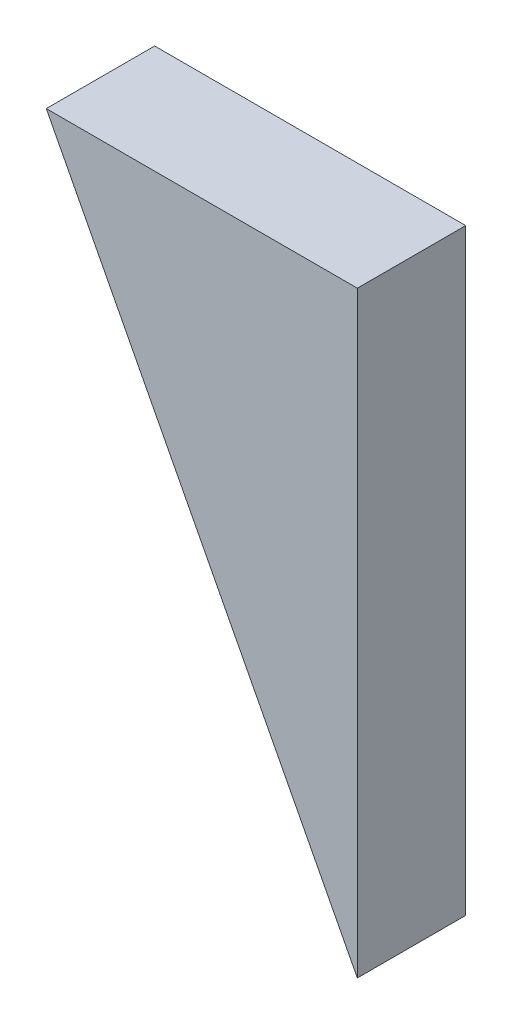
ISO-10303-21;
HEADER;
FILE_DESCRIPTION(('STEP AP214'),'2;1');
FILE_NAME('part.step','',(''),(''),'','','');
FILE_SCHEMA(('AUTOMOTIVE_DESIGN { 1 0 10303 214 1 1 1 1 }'));
ENDSEC;
DATA;
#1=APPLICATION_CONTEXT('core data for automotive mechanical design processes');
#2=APPLICATION_PROTOCOL_DEFINITION('international standard','automotive_design',2000,#1);
#3=PRODUCT_CONTEXT('',#1,'mechanical');
#4=PRODUCT('Part','Part','',(#3));
#5=PRODUCT_RELATED_PRODUCT_CATEGORY('part','',(#4));
#6=PRODUCT_DEFINITION_FORMATION('','',#4);
#7=PRODUCT_DEFINITION_CONTEXT('part definition',#1,'design');
#8=PRODUCT_DEFINITION('design','',#6,#7);
#9=PRODUCT_DEFINITION_SHAPE('','',#8);
#10=(LENGTH_UNIT() NAMED_UNIT(*) SI_UNIT(.MILLI.,.METRE.));
#11=(NAMED_UNIT(*) PLANE_ANGLE_UNIT() SI_UNIT($,.RADIAN.));
#12=(NAMED_UNIT(*) SI_UNIT($,.STERADIAN.) SOLID_ANGLE_UNIT());
#13=UNCERTAINTY_MEASURE_WITH_UNIT(LENGTH_MEASURE(1.E-05),#10,'distance_accuracy_value','');
#14=(GEOMETRIC_REPRESENTATION_CONTEXT(3) GLOBAL_UNCERTAINTY_ASSIGNED_CONTEXT((#13)) GLOBAL_UNIT_ASSIGNED_CONTEXT((#10,
#11,#12)) REPRESENTATION_CONTEXT('',''));
#15=CARTESIAN_POINT('',(0.,0.,0.));
#16=DIRECTION('',(0.,0.,1.));
#17=DIRECTION('',(1.,0.,0.));
#18=AXIS2_PLACEMENT_3D('',#15,#16,#17);
#19=CARTESIAN_POINT('',(-18.225,20.,-6.35));
#20=DIRECTION('',(-0.886957340158769,-0.461851357839816,0.));
#21=DIRECTION('',(0.461851357839816,-0.886957340158769,0.));
#22=AXIS2_PLACEMENT_3D('',#19,#20,#21);
#23=PLANE('',#22);
#24=DIRECTION('',(0.461851357839816,-0.886957340158769,0.));
#25=VECTOR('',#24,1.);
#26=CARTESIAN_POINT('',(-18.225,20.,0.));
#27=LINE('',#26,#25);
#28=CARTESIAN_POINT('',(-18.225,20.,0.));
#29=VERTEX_POINT('',#28);
#30=CARTESIAN_POINT('',(0.,-15.,0.));
#31=VERTEX_POINT('',#30);
#32=EDGE_CURVE('E91',#29,#31,#27,.T.);
#33=ORIENTED_EDGE('',*,*,#32,.F.);
#34=DIRECTION('',(0.,0.,1.));
#35=VECTOR('',#34,1.);
#36=CARTESIAN_POINT('',(-18.225,20.,-6.35));
#37=LINE('',#36,#35);
#38=CARTESIAN_POINT('',(-18.225,20.,-6.35));
#39=VERTEX_POINT('',#38);
#40=EDGE_CURVE('E11',#39,#29,#37,.T.);
#41=ORIENTED_EDGE('',*,*,#40,.F.);
#42=DIRECTION('',(0.461851357839816,-0.886957340158769,0.));
#43=VECTOR('',#42,1.);
#44=CARTESIAN_POINT('',(-18.225,20.,-6.35));
#45=LINE('',#44,#43);
#46=CARTESIAN_POINT('',(0.,-15.,-6.35));
#47=VERTEX_POINT('',#46);
#48=EDGE_CURVE('E83',#39,#47,#45,.T.);
#49=ORIENTED_EDGE('',*,*,#48,.T.);
#50=DIRECTION('',(0.,0.,1.));
#51=VECTOR('',#50,1.);
#52=CARTESIAN_POINT('',(0.,-15.,-6.35));
#53=LINE('',#52,#51);
#54=EDGE_CURVE('E42',#47,#31,#53,.T.);
#55=ORIENTED_EDGE('',*,*,#54,.T.);
#56=EDGE_LOOP('',(#33,#41,#49,#55));
#57=FACE_BOUND('',#56,.T.);
#58=ADVANCED_FACE('F39',(#57),#23,.T.);
#59=CARTESIAN_POINT('',(0.,20.,-6.35));
#60=DIRECTION('',(0.,1.,0.));
#61=DIRECTION('',(-1.,0.,0.));
#62=AXIS2_PLACEMENT_3D('',#59,#60,#61);
#63=PLANE('',#62);
#64=DIRECTION('',(-1.,0.,0.));
#65=VECTOR('',#64,1.);
#66=CARTESIAN_POINT('',(0.,20.,0.));
#67=LINE('',#66,#65);
#68=CARTESIAN_POINT('',(0.,20.,0.));
#69=VERTEX_POINT('',#68);
#70=EDGE_CURVE('E85',#69,#29,#67,.T.);
#71=ORIENTED_EDGE('',*,*,#70,.F.);
#72=DIRECTION('',(0.,0.,1.));
#73=VECTOR('',#72,1.);
#74=CARTESIAN_POINT('',(0.,20.,-6.35));
#75=LINE('',#74,#73);
#76=CARTESIAN_POINT('',(0.,20.,-6.35));
#77=VERTEX_POINT('',#76);
#78=EDGE_CURVE('E48',#77,#69,#75,.T.);
#79=ORIENTED_EDGE('',*,*,#78,.F.);
#80=DIRECTION('',(-1.,0.,0.));
#81=VECTOR('',#80,1.);
#82=CARTESIAN_POINT('',(0.,20.,-6.35));
#83=LINE('',#82,#81);
#84=EDGE_CURVE('E80',#77,#39,#83,.T.);
#85=ORIENTED_EDGE('',*,*,#84,.T.);
#86=ORIENTED_EDGE('',*,*,#40,.T.);
#87=EDGE_LOOP('',(#71,#79,#85,#86));
#88=FACE_BOUND('',#87,.T.);
#89=ADVANCED_FACE('F95',(#88),#63,.T.);
#90=CARTESIAN_POINT('',(0.,-15.,-6.35));
#91=DIRECTION('',(1.,0.,0.));
#92=DIRECTION('',(0.,0.,-1.));
#93=AXIS2_PLACEMENT_3D('',#90,#91,#92);
#94=PLANE('',#93);
#95=DIRECTION('',(0.,1.,0.));
#96=VECTOR('',#95,1.);
#97=CARTESIAN_POINT('',(0.,-15.,0.));
#98=LINE('',#97,#96);
#99=EDGE_CURVE('E78',#31,#69,#98,.T.);
#100=ORIENTED_EDGE('',*,*,#99,.F.);
#101=ORIENTED_EDGE('',*,*,#54,.F.);
#102=DIRECTION('',(0.,1.,0.));
#103=VECTOR('',#102,1.);
#104=CARTESIAN_POINT('',(0.,-15.,-6.35));
#105=LINE('',#104,#103);
#106=EDGE_CURVE('E76',#47,#77,#105,.T.);
#107=ORIENTED_EDGE('',*,*,#106,.T.);
#108=ORIENTED_EDGE('',*,*,#78,.T.);
#109=EDGE_LOOP('',(#100,#101,#107,#108));
#110=FACE_BOUND('',#109,.T.);
#111=ADVANCED_FACE('F75',(#110),#94,.T.);
#112=CARTESIAN_POINT('',(0.,0.,-6.35));
#113=DIRECTION('',(0.,0.,-1.));
#114=DIRECTION('',(-1.,0.,0.));
#115=AXIS2_PLACEMENT_3D('',#112,#113,#114);
#116=PLANE('',#115);
#117=ORIENTED_EDGE('',*,*,#48,.F.);
#118=ORIENTED_EDGE('',*,*,#84,.F.);
#119=ORIENTED_EDGE('',*,*,#106,.F.);
#120=EDGE_LOOP('',(#117,#118,#119));
#121=FACE_BOUND('',#120,.T.);
#122=ADVANCED_FACE('F82',(#121),#116,.T.);
#123=CARTESIAN_POINT('',(0.,0.,0.));
#124=DIRECTION('',(0.,0.,-1.));
#125=DIRECTION('',(-1.,0.,0.));
#126=AXIS2_PLACEMENT_3D('',#123,#124,#125);
#127=PLANE('',#126);
#128=ORIENTED_EDGE('',*,*,#32,.T.);
#129=ORIENTED_EDGE('',*,*,#99,.T.);
#130=ORIENTED_EDGE('',*,*,#70,.T.);
#131=EDGE_LOOP('',(#128,#129,#130));
#132=FACE_BOUND('',#131,.T.);
#133=ADVANCED_FACE('F94',(#132),#127,.F.);
#134=CLOSED_SHELL('',(#58,#89,#111,#122,#133));
#135=MANIFOLD_SOLID_BREP('B2',#134);
#136=ADVANCED_BREP_SHAPE_REPRESENTATION('',(#18,#135),#14);
#137=SHAPE_DEFINITION_REPRESENTATION(#9,#136);
ENDSEC;
END-ISO-10303-21;
